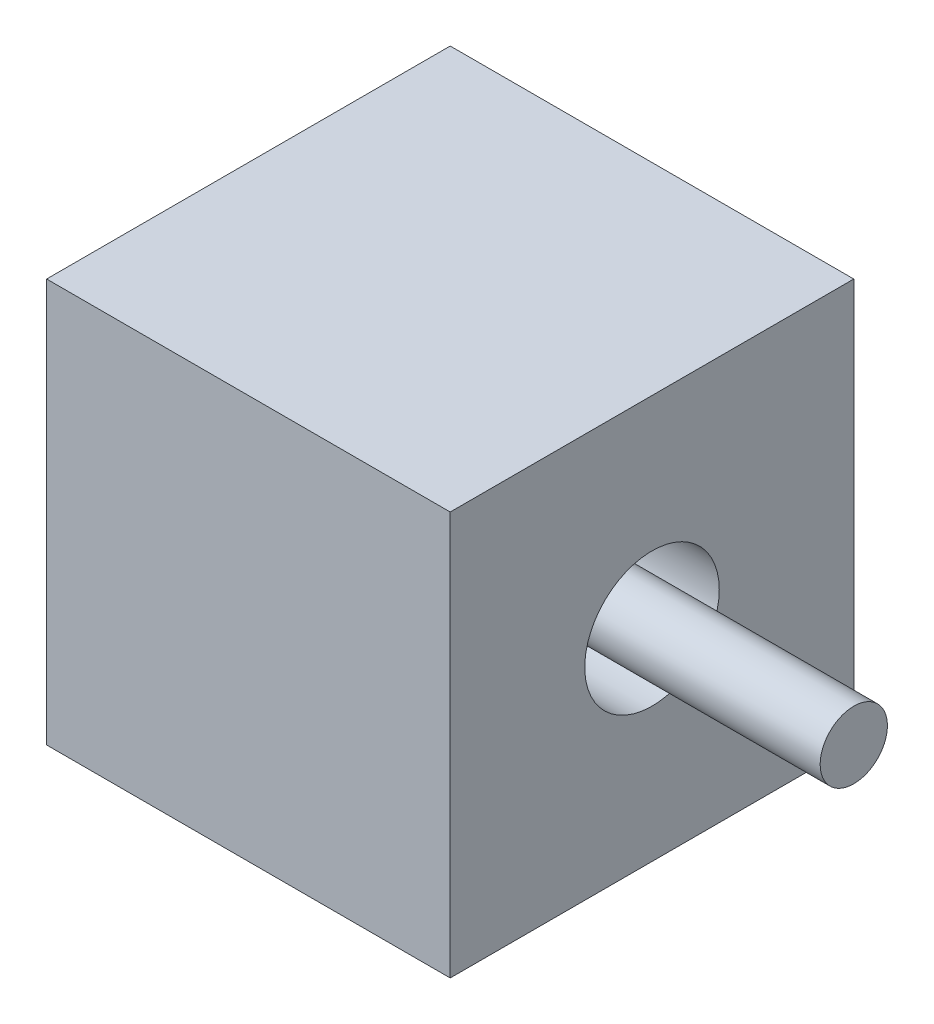
ISO-10303-21;
HEADER;
FILE_DESCRIPTION(('STEP AP214'),'2;1');
FILE_NAME('part.step','',(''),(''),'','','');
FILE_SCHEMA(('AUTOMOTIVE_DESIGN { 1 0 10303 214 1 1 1 1 }'));
ENDSEC;
DATA;
#1=APPLICATION_CONTEXT('core data for automotive mechanical design processes');
#2=APPLICATION_PROTOCOL_DEFINITION('international standard','automotive_design',2000,#1);
#3=PRODUCT_CONTEXT('',#1,'mechanical');
#4=PRODUCT('Part','Part','',(#3));
#5=PRODUCT_RELATED_PRODUCT_CATEGORY('part','',(#4));
#6=PRODUCT_DEFINITION_FORMATION('','',#4);
#7=PRODUCT_DEFINITION_CONTEXT('part definition',#1,'design');
#8=PRODUCT_DEFINITION('design','',#6,#7);
#9=PRODUCT_DEFINITION_SHAPE('','',#8);
#10=(LENGTH_UNIT() NAMED_UNIT(*) SI_UNIT(.MILLI.,.METRE.));
#11=(NAMED_UNIT(*) PLANE_ANGLE_UNIT() SI_UNIT($,.RADIAN.));
#12=(NAMED_UNIT(*) SI_UNIT($,.STERADIAN.) SOLID_ANGLE_UNIT());
#13=UNCERTAINTY_MEASURE_WITH_UNIT(LENGTH_MEASURE(1.E-05),#10,'distance_accuracy_value','');
#14=(GEOMETRIC_REPRESENTATION_CONTEXT(3) GLOBAL_UNCERTAINTY_ASSIGNED_CONTEXT((#13)) GLOBAL_UNIT_ASSIGNED_CONTEXT((#10,
#11,#12)) REPRESENTATION_CONTEXT('',''));
#15=CARTESIAN_POINT('',(0.,0.,0.));
#16=DIRECTION('',(0.,0.,1.));
#17=DIRECTION('',(1.,0.,0.));
#18=AXIS2_PLACEMENT_3D('',#15,#16,#17);
#19=CARTESIAN_POINT('',(-27.4832522542715,-23.8201326796593,43.4101011721987));
#20=DIRECTION('',(1.,0.,0.));
#21=DIRECTION('',(0.,0.,-1.));
#22=AXIS2_PLACEMENT_3D('',#19,#20,#21);
#23=PLANE('',#22);
#24=CARTESIAN_POINT('',(-27.4832522542715,-8.82013267965931,28.4101011721987));
#25=DIRECTION('',(1.,0.,0.));
#26=DIRECTION('',(0.,0.,-1.));
#27=AXIS2_PLACEMENT_3D('',#24,#25,#26);
#28=CIRCLE('',#27,5.);
#29=CARTESIAN_POINT('',(-27.4832522542715,-8.82013267965931,23.4101011721987));
#30=VERTEX_POINT('',#29);
#31=EDGE_CURVE('P0_E102',#30,#30,#28,.T.);
#32=ORIENTED_EDGE('',*,*,#31,.F.);
#33=EDGE_LOOP('',(#32));
#34=FACE_BOUND('',#33,.T.);
#35=DIRECTION('',(0.,0.,-1.));
#36=VECTOR('',#35,1.);
#37=CARTESIAN_POINT('',(-27.4832522542715,6.17986732034069,43.4101011721987));
#38=LINE('',#37,#36);
#39=CARTESIAN_POINT('',(-27.4832522542715,6.17986732034069,43.4101011721987));
#40=VERTEX_POINT('',#39);
#41=CARTESIAN_POINT('',(-27.4832522542715,6.17986732034069,13.4101011721987));
#42=VERTEX_POINT('',#41);
#43=EDGE_CURVE('P0_E98',#40,#42,#38,.T.);
#44=ORIENTED_EDGE('',*,*,#43,.F.);
#45=DIRECTION('',(0.,1.,0.));
#46=VECTOR('',#45,1.);
#47=CARTESIAN_POINT('',(-27.4832522542715,-23.8201326796593,43.4101011721987));
#48=LINE('',#47,#46);
#49=CARTESIAN_POINT('',(-27.4832522542715,-23.8201326796593,43.4101011721987));
#50=VERTEX_POINT('',#49);
#51=EDGE_CURVE('P0_E11',#50,#40,#48,.T.);
#52=ORIENTED_EDGE('',*,*,#51,.F.);
#53=DIRECTION('',(0.,0.,-1.));
#54=VECTOR('',#53,1.);
#55=CARTESIAN_POINT('',(-27.4832522542715,-23.8201326796593,43.4101011721987));
#56=LINE('',#55,#54);
#57=CARTESIAN_POINT('',(-27.4832522542715,-23.8201326796593,13.4101011721987));
#58=VERTEX_POINT('',#57);
#59=EDGE_CURVE('P0_E91',#50,#58,#56,.T.);
#60=ORIENTED_EDGE('',*,*,#59,.T.);
#61=DIRECTION('',(0.,1.,0.));
#62=VECTOR('',#61,1.);
#63=CARTESIAN_POINT('',(-27.4832522542715,-23.8201326796593,13.4101011721987));
#64=LINE('',#63,#62);
#65=EDGE_CURVE('P0_E36',#58,#42,#64,.T.);
#66=ORIENTED_EDGE('',*,*,#65,.T.);
#67=EDGE_LOOP('',(#44,#52,#60,#66));
#68=FACE_BOUND('',#67,.T.);
#69=ADVANCED_FACE('P0_F33',(#34,#68),#23,.T.);
#70=CARTESIAN_POINT('',(-57.4832522542715,-23.8201326796593,43.4101011721987));
#71=DIRECTION('',(0.,0.,1.));
#72=DIRECTION('',(1.,0.,0.));
#73=AXIS2_PLACEMENT_3D('',#70,#71,#72);
#74=PLANE('',#73);
#75=DIRECTION('',(1.,0.,0.));
#76=VECTOR('',#75,1.);
#77=CARTESIAN_POINT('',(-57.4832522542715,6.17986732034069,43.4101011721987));
#78=LINE('',#77,#76);
#79=CARTESIAN_POINT('',(-57.4832522542715,6.17986732034069,43.4101011721987));
#80=VERTEX_POINT('',#79);
#81=EDGE_CURVE('P0_E93',#80,#40,#78,.T.);
#82=ORIENTED_EDGE('',*,*,#81,.F.);
#83=DIRECTION('',(0.,1.,0.));
#84=VECTOR('',#83,1.);
#85=CARTESIAN_POINT('',(-57.4832522542715,-23.8201326796593,43.4101011721987));
#86=LINE('',#85,#84);
#87=CARTESIAN_POINT('',(-57.4832522542715,-23.8201326796593,43.4101011721987));
#88=VERTEX_POINT('',#87);
#89=EDGE_CURVE('P0_E42',#88,#80,#86,.T.);
#90=ORIENTED_EDGE('',*,*,#89,.F.);
#91=DIRECTION('',(1.,0.,0.));
#92=VECTOR('',#91,1.);
#93=CARTESIAN_POINT('',(-57.4832522542715,-23.8201326796593,43.4101011721987));
#94=LINE('',#93,#92);
#95=EDGE_CURVE('P0_E88',#88,#50,#94,.T.);
#96=ORIENTED_EDGE('',*,*,#95,.T.);
#97=ORIENTED_EDGE('',*,*,#51,.T.);
#98=EDGE_LOOP('',(#82,#90,#96,#97));
#99=FACE_BOUND('',#98,.T.);
#100=ADVANCED_FACE('P0_F109',(#99),#74,.T.);
#101=CARTESIAN_POINT('',(-57.4832522542715,-23.8201326796593,13.4101011721987));
#102=DIRECTION('',(-1.,0.,0.));
#103=DIRECTION('',(0.,0.,1.));
#104=AXIS2_PLACEMENT_3D('',#101,#102,#103);
#105=PLANE('',#104);
#106=DIRECTION('',(0.,0.,1.));
#107=VECTOR('',#106,1.);
#108=CARTESIAN_POINT('',(-57.4832522542715,6.17986732034069,13.4101011721987));
#109=LINE('',#108,#107);
#110=CARTESIAN_POINT('',(-57.4832522542715,6.17986732034069,13.4101011721987));
#111=VERTEX_POINT('',#110);
#112=EDGE_CURVE('P0_E83',#111,#80,#109,.T.);
#113=ORIENTED_EDGE('',*,*,#112,.F.);
#114=DIRECTION('',(0.,1.,0.));
#115=VECTOR('',#114,1.);
#116=CARTESIAN_POINT('',(-57.4832522542715,-23.8201326796593,13.4101011721987));
#117=LINE('',#116,#115);
#118=CARTESIAN_POINT('',(-57.4832522542715,-23.8201326796593,13.4101011721987));
#119=VERTEX_POINT('',#118);
#120=EDGE_CURVE('P0_E78',#119,#111,#117,.T.);
#121=ORIENTED_EDGE('',*,*,#120,.F.);
#122=DIRECTION('',(0.,0.,1.));
#123=VECTOR('',#122,1.);
#124=CARTESIAN_POINT('',(-57.4832522542715,-23.8201326796593,13.4101011721987));
#125=LINE('',#124,#123);
#126=EDGE_CURVE('P0_E81',#119,#88,#125,.T.);
#127=ORIENTED_EDGE('',*,*,#126,.T.);
#128=ORIENTED_EDGE('',*,*,#89,.T.);
#129=EDGE_LOOP('',(#113,#121,#127,#128));
#130=FACE_BOUND('',#129,.T.);
#131=ADVANCED_FACE('P0_F80',(#130),#105,.T.);
#132=CARTESIAN_POINT('',(-27.4832522542715,-23.8201326796593,13.4101011721987));
#133=DIRECTION('',(0.,0.,-1.));
#134=DIRECTION('',(-1.,0.,0.));
#135=AXIS2_PLACEMENT_3D('',#132,#133,#134);
#136=PLANE('',#135);
#137=DIRECTION('',(-1.,0.,0.));
#138=VECTOR('',#137,1.);
#139=CARTESIAN_POINT('',(-27.4832522542715,6.17986732034069,13.4101011721987));
#140=LINE('',#139,#138);
#141=EDGE_CURVE('P0_E101',#42,#111,#140,.T.);
#142=ORIENTED_EDGE('',*,*,#141,.F.);
#143=ORIENTED_EDGE('',*,*,#65,.F.);
#144=DIRECTION('',(-1.,0.,0.));
#145=VECTOR('',#144,1.);
#146=CARTESIAN_POINT('',(-27.4832522542715,-23.8201326796593,13.4101011721987));
#147=LINE('',#146,#145);
#148=EDGE_CURVE('P0_E87',#58,#119,#147,.T.);
#149=ORIENTED_EDGE('',*,*,#148,.T.);
#150=ORIENTED_EDGE('',*,*,#120,.T.);
#151=EDGE_LOOP('',(#142,#143,#149,#150));
#152=FACE_BOUND('',#151,.T.);
#153=ADVANCED_FACE('P0_F90',(#152),#136,.T.);
#154=CARTESIAN_POINT('',(0.,-23.8201326796593,0.));
#155=DIRECTION('',(0.,1.,0.));
#156=DIRECTION('',(0.,0.,1.));
#157=AXIS2_PLACEMENT_3D('',#154,#155,#156);
#158=PLANE('',#157);
#159=ORIENTED_EDGE('',*,*,#59,.F.);
#160=ORIENTED_EDGE('',*,*,#95,.F.);
#161=ORIENTED_EDGE('',*,*,#126,.F.);
#162=ORIENTED_EDGE('',*,*,#148,.F.);
#163=EDGE_LOOP('',(#159,#160,#161,#162));
#164=FACE_BOUND('',#163,.T.);
#165=ADVANCED_FACE('P0_F86',(#164),#158,.F.);
#166=CARTESIAN_POINT('',(0.,6.17986732034069,0.));
#167=DIRECTION('',(0.,1.,0.));
#168=DIRECTION('',(0.,0.,1.));
#169=AXIS2_PLACEMENT_3D('',#166,#167,#168);
#170=PLANE('',#169);
#171=ORIENTED_EDGE('',*,*,#43,.T.);
#172=ORIENTED_EDGE('',*,*,#141,.T.);
#173=ORIENTED_EDGE('',*,*,#112,.T.);
#174=ORIENTED_EDGE('',*,*,#81,.T.);
#175=EDGE_LOOP('',(#171,#172,#173,#174));
#176=FACE_BOUND('',#175,.T.);
#177=ADVANCED_FACE('P0_F108',(#176),#170,.T.);
#178=CARTESIAN_POINT('',(-42.4832522542715,-8.82013267965931,28.4101011721987));
#179=DIRECTION('',(1.,0.,0.));
#180=DIRECTION('',(0.,1.,0.));
#181=AXIS2_PLACEMENT_3D('',#178,#179,#180);
#182=SPHERICAL_SURFACE('',#181,10.);
#183=CARTESIAN_POINT('',(-33.8229982164271,-8.82013267965931,28.4101011721987));
#184=DIRECTION('',(1.,0.,0.));
#185=DIRECTION('',(0.,0.,-1.));
#186=AXIS2_PLACEMENT_3D('',#183,#184,#185);
#187=CIRCLE('',#186,5.);
#188=CARTESIAN_POINT('',(-33.8229982164271,-8.82013267965931,23.4101011721987));
#189=VERTEX_POINT('',#188);
#190=EDGE_CURVE('P0_E140',#189,#189,#187,.T.);
#191=ORIENTED_EDGE('',*,*,#190,.T.);
#192=EDGE_LOOP('',(#191));
#193=FACE_BOUND('',#192,.T.);
#194=ADVANCED_FACE('P0_F127',(#193),#182,.F.);
#195=CARTESIAN_POINT('',(-52.4832522542715,-8.82013267965931,28.4101011721987));
#196=DIRECTION('',(1.,0.,0.));
#197=DIRECTION('',(0.,0.,-1.));
#198=AXIS2_PLACEMENT_3D('',#195,#196,#197);
#199=CYLINDRICAL_SURFACE('',#198,5.);
#200=ORIENTED_EDGE('',*,*,#190,.F.);
#201=EDGE_LOOP('',(#200));
#202=FACE_BOUND('',#201,.T.);
#203=ORIENTED_EDGE('',*,*,#31,.T.);
#204=EDGE_LOOP('',(#203));
#205=FACE_BOUND('',#204,.T.);
#206=ADVANCED_FACE('P0_F131',(#202,#205),#199,.F.);
#207=CLOSED_SHELL('',(#69,#100,#131,#153,#165,#177,#194,#206));
#208=MANIFOLD_SOLID_BREP('P0_B2',#207);
#209=CARTESIAN_POINT('',(-42.4832522542715,-8.82013267965931,28.4101011721987));
#210=DIRECTION('',(1.,0.,0.));
#211=DIRECTION('',(0.,-0.945212283173989,-0.326456336647055));
#212=AXIS2_PLACEMENT_3D('',#209,#210,#211);
#213=CYLINDRICAL_SURFACE('',#212,2.5);
#214=CARTESIAN_POINT('',(-34.8839101774862,-8.82013267965931,28.4101011721987));
#215=DIRECTION('',(-1.,0.,0.));
#216=DIRECTION('',(0.,0.945212283173989,0.326456336647055));
#217=AXIS2_PLACEMENT_3D('',#214,#215,#216);
#218=CIRCLE('',#217,2.5);
#219=CARTESIAN_POINT('',(-34.8839101774862,-6.45710197172434,29.2262420138163));
#220=VERTEX_POINT('',#219);
#221=EDGE_CURVE('P1_E21',#220,#220,#218,.F.);
#222=ORIENTED_EDGE('',*,*,#221,.T.);
#223=EDGE_LOOP('',(#222));
#224=FACE_BOUND('',#223,.T.);
#225=CARTESIAN_POINT('',(-12.4832522542715,-8.82013267965931,28.4101011721987));
#226=DIRECTION('',(-1.,0.,0.));
#227=DIRECTION('',(0.,0.945212283173989,0.326456336647055));
#228=AXIS2_PLACEMENT_3D('',#225,#226,#227);
#229=CIRCLE('',#228,2.5);
#230=CARTESIAN_POINT('',(-12.4832522542715,-6.45710197172434,29.2262420138163));
#231=VERTEX_POINT('',#230);
#232=EDGE_CURVE('P1_E10',#231,#231,#229,.T.);
#233=ORIENTED_EDGE('',*,*,#232,.T.);
#234=EDGE_LOOP('',(#233));
#235=FACE_BOUND('',#234,.T.);
#236=ADVANCED_FACE('P1_F18',(#224,#235),#213,.T.);
#237=CARTESIAN_POINT('',(-12.4832522542715,-8.82013267965931,28.4101011721987));
#238=DIRECTION('',(-1.,0.,0.));
#239=DIRECTION('',(0.,0.945212283173989,0.326456336647055));
#240=AXIS2_PLACEMENT_3D('',#237,#238,#239);
#241=PLANE('',#240);
#242=ORIENTED_EDGE('',*,*,#232,.F.);
#243=EDGE_LOOP('',(#242));
#244=FACE_BOUND('',#243,.T.);
#245=ADVANCED_FACE('P1_F52',(#244),#241,.F.);
#246=CARTESIAN_POINT('',(-42.4832522542715,-8.82013267965931,28.4101011721987));
#247=DIRECTION('',(0.,0.945212283173989,0.326456336647055));
#248=DIRECTION('',(0.,-0.326456336647055,0.945212283173989));
#249=AXIS2_PLACEMENT_3D('',#246,#247,#248);
#250=SPHERICAL_SURFACE('',#249,8.);
#251=CARTESIAN_POINT('',(-42.4832522542715,-8.82013267965931,28.4101011721987));
#252=DIRECTION('',(-1.,0.,0.));
#253=DIRECTION('',(0.,0.945212283173989,0.326456336647055));
#254=AXIS2_PLACEMENT_3D('',#251,#252,#253);
#255=SPHERICAL_SURFACE('',#254,8.);
#256=ORIENTED_EDGE('',*,*,#221,.F.);
#257=EDGE_LOOP('',(#256));
#258=FACE_BOUND('',#257,.T.);
#259=ADVANCED_FACE('P1_F51',(#258),#255,.T.);
#260=CLOSED_SHELL('',(#236,#245,#259));
#261=CARTESIAN_POINT('',(-42.4832522542715,-8.82013267965931,28.4101011721987));
#262=DIRECTION('',(0.,0.945212283173989,0.326456336647055));
#263=DIRECTION('',(0.,-0.326456336647055,0.945212283173989));
#264=AXIS2_PLACEMENT_3D('',#261,#262,#263);
#265=SPHERICAL_SURFACE('',#264,2.5);
#266=CARTESIAN_POINT('',(-42.4832522542715,-8.82013267965931,28.4101011721987));
#267=DIRECTION('',(-1.,0.,0.));
#268=DIRECTION('',(0.,0.945212283173989,0.326456336647055));
#269=AXIS2_PLACEMENT_3D('',#266,#267,#268);
#270=SPHERICAL_SURFACE('',#269,2.5);
#271=CARTESIAN_POINT('',(-42.4832522542715,-8.82013267965931,28.4101011721987));
#272=DIRECTION('',(-1.,0.,0.));
#273=DIRECTION('',(0.,0.945212283173989,0.326456336647055));
#274=AXIS2_PLACEMENT_3D('',#271,#272,#273);
#275=CIRCLE('',#274,2.5);
#276=CARTESIAN_POINT('',(-42.4832522542715,-6.45710197172434,29.2262420138163));
#277=VERTEX_POINT('',#276);
#278=EDGE_CURVE('P1_E32',#277,#277,#275,.T.);
#279=ORIENTED_EDGE('',*,*,#278,.F.);
#280=EDGE_LOOP('',(#279));
#281=FACE_BOUND('',#280,.T.);
#282=ADVANCED_FACE('P1_F41',(#281),#270,.F.);
#283=CARTESIAN_POINT('',(-42.4832522542715,-8.82013267965931,28.4101011721987));
#284=DIRECTION('',(-1.,0.,0.));
#285=DIRECTION('',(0.,0.945212283173989,0.326456336647055));
#286=AXIS2_PLACEMENT_3D('',#283,#284,#285);
#287=PLANE('',#286);
#288=ORIENTED_EDGE('',*,*,#278,.T.);
#289=EDGE_LOOP('',(#288));
#290=FACE_BOUND('',#289,.T.);
#291=ADVANCED_FACE('P1_F39',(#290),#287,.T.);
#292=CLOSED_SHELL('',(#282,#291));
#293=ORIENTED_CLOSED_SHELL('',*,#292,.T.);
#294=BREP_WITH_VOIDS('P1_B1',#260,(#293));
#295=ADVANCED_BREP_SHAPE_REPRESENTATION('',(#18,#208,#294),#14);
#296=SHAPE_DEFINITION_REPRESENTATION(#9,#295);
ENDSEC;
END-ISO-10303-21;
